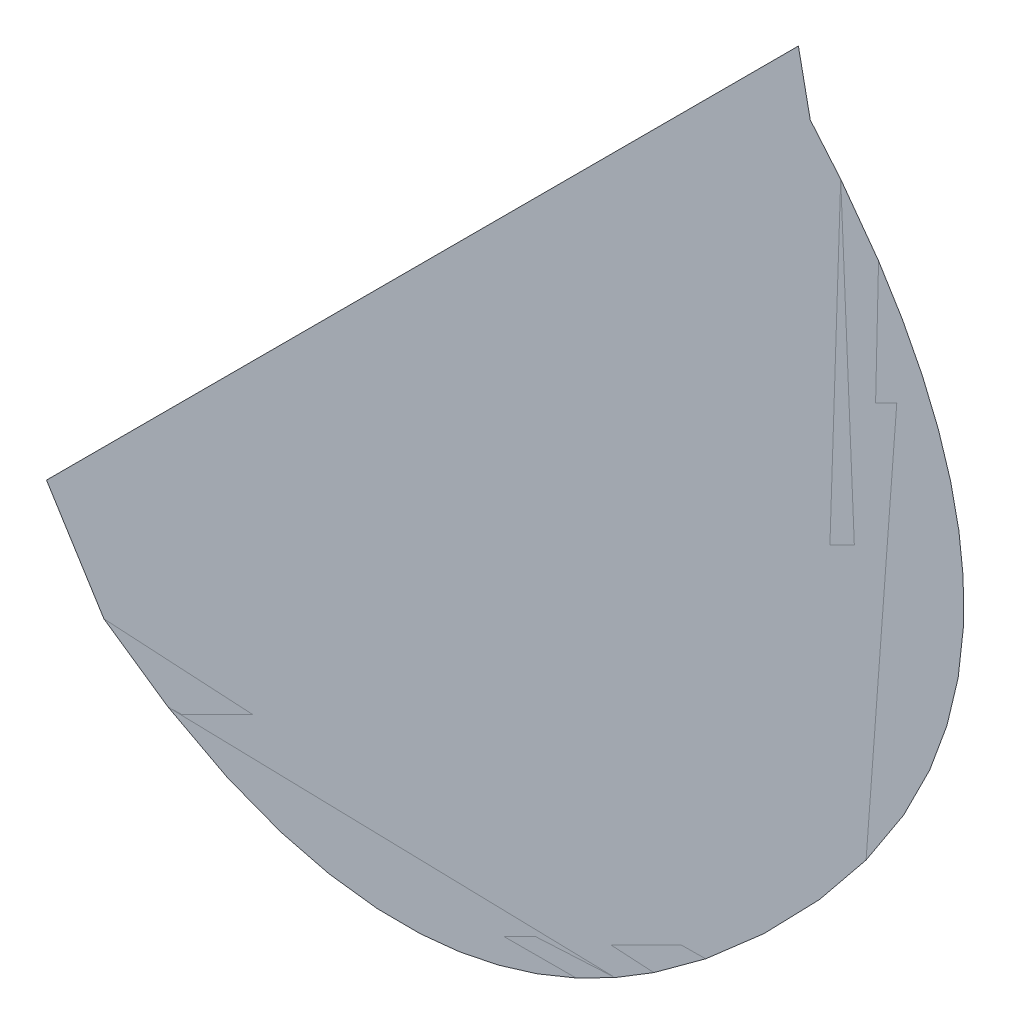
ISO-10303-21;
HEADER;
FILE_DESCRIPTION(('STEP AP214'),'2;1');
FILE_NAME('part.step','',(''),(''),'','','');
FILE_SCHEMA(('AUTOMOTIVE_DESIGN { 1 0 10303 214 1 1 1 1 }'));
ENDSEC;
DATA;
#1=APPLICATION_CONTEXT('core data for automotive mechanical design processes');
#2=APPLICATION_PROTOCOL_DEFINITION('international standard','automotive_design',2000,#1);
#3=PRODUCT_CONTEXT('',#1,'mechanical');
#4=PRODUCT('Part','Part','',(#3));
#5=PRODUCT_RELATED_PRODUCT_CATEGORY('part','',(#4));
#6=PRODUCT_DEFINITION_FORMATION('','',#4);
#7=PRODUCT_DEFINITION_CONTEXT('part definition',#1,'design');
#8=PRODUCT_DEFINITION('design','',#6,#7);
#9=PRODUCT_DEFINITION_SHAPE('','',#8);
#10=(LENGTH_UNIT() NAMED_UNIT(*) SI_UNIT(.MILLI.,.METRE.));
#11=(NAMED_UNIT(*) PLANE_ANGLE_UNIT() SI_UNIT($,.RADIAN.));
#12=(NAMED_UNIT(*) SI_UNIT($,.STERADIAN.) SOLID_ANGLE_UNIT());
#13=UNCERTAINTY_MEASURE_WITH_UNIT(LENGTH_MEASURE(1.E-05),#10,'distance_accuracy_value','');
#14=(GEOMETRIC_REPRESENTATION_CONTEXT(3) GLOBAL_UNCERTAINTY_ASSIGNED_CONTEXT((#13)) GLOBAL_UNIT_ASSIGNED_CONTEXT((#10,
#11,#12)) REPRESENTATION_CONTEXT('',''));
#15=CARTESIAN_POINT('',(0.,0.,0.));
#16=DIRECTION('',(0.,0.,1.));
#17=DIRECTION('',(1.,0.,0.));
#18=AXIS2_PLACEMENT_3D('',#15,#16,#17);
#19=CARTESIAN_POINT('',(28.285599848586,36.385598881883,0.0128));
#20=DIRECTION('',(0.,0.,1.));
#21=DIRECTION('',(1.,0.,0.));
#22=AXIS2_PLACEMENT_3D('',#19,#20,#21);
#23=PLANE('',#22);
#24=CARTESIAN_POINT('',(28.409343983178,36.431561778544,0.0227));
#25=DIRECTION('',(-0.707106781186555,-0.70710678118654,0.));
#26=VECTOR('',#25,1.);
#27=LINE('',#24,#26);
#28=CARTESIAN_POINT('',(28.409343983178,36.431561778544,0.01775));
#29=VERTEX_POINT('',#28);
#30=CARTESIAN_POINT('',(28.239636951926,36.261854747292,0.01775));
#31=VERTEX_POINT('',#30);
#32=EDGE_CURVE('E11',#29,#31,#27,.T.);
#33=ORIENTED_EDGE('',*,*,#32,.F.);
#34=CARTESIAN_POINT('',(28.239636951926,36.261854747292,0.0227));
#35=CARTESIAN_POINT('',(28.3247072850688,36.1785384900637,0.0227));
#36=CARTESIAN_POINT('',(28.409353000056,36.261863954,0.0227));
#37=CARTESIAN_POINT('',(28.4939664897613,36.3451576952842,0.0227));
#38=CARTESIAN_POINT('',(28.409343983178,36.431561778544,0.0227));
#39=B_SPLINE_CURVE_WITH_KNOTS('',2,(#34,#35,#36,#37,#38),.UNSPECIFIED.,.F.,.F.,(3,2,3),(0.,0.5,
1.),.UNSPECIFIED.);
#40=EDGE_CURVE('E30',#31,#29,#39,.T.);
#41=ORIENTED_EDGE('',*,*,#40,.F.);
#42=EDGE_LOOP('',(#33,#41));
#43=FACE_BOUND('',#42,.T.);
#44=ADVANCED_FACE('F17',(#43),#23,.F.);
#45=CARTESIAN_POINT('',(28.285599848586,36.385598881883,0.0227));
#46=DIRECTION('',(0.,0.,1.));
#47=DIRECTION('',(1.,0.,0.));
#48=AXIS2_PLACEMENT_3D('',#45,#46,#47);
#49=PLANE('',#48);
#50=ORIENTED_EDGE('',*,*,#40,.T.);
#51=ORIENTED_EDGE('',*,*,#32,.T.);
#52=EDGE_LOOP('',(#50,#51));
#53=FACE_BOUND('',#52,.T.);
#54=ADVANCED_FACE('F19',(#53),#49,.T.);
#55=CLOSED_SHELL('',(#44,#54));
#56=MANIFOLD_SOLID_BREP('B1',#55);
#57=ADVANCED_BREP_SHAPE_REPRESENTATION('',(#18,#56),#14);
#58=SHAPE_DEFINITION_REPRESENTATION(#9,#57);
ENDSEC;
END-ISO-10303-21;
